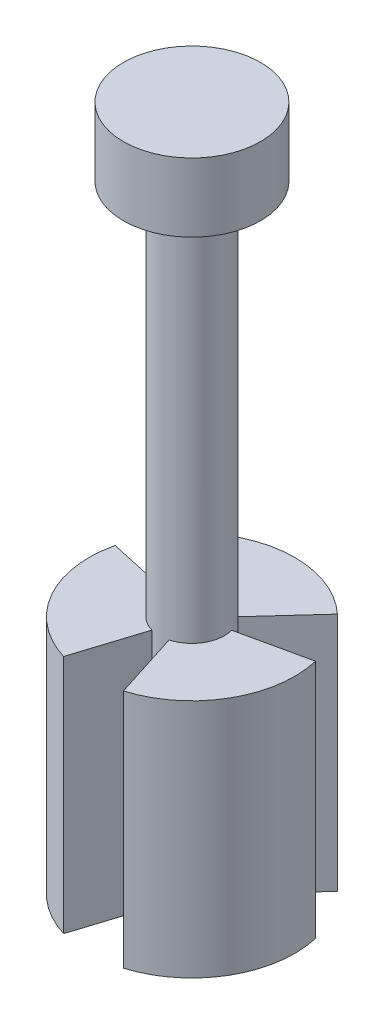
ISO-10303-21;
HEADER;
FILE_DESCRIPTION(('STEP AP214'),'2;1');
FILE_NAME('part.step','',(''),(''),'','','');
FILE_SCHEMA(('AUTOMOTIVE_DESIGN { 1 0 10303 214 1 1 1 1 }'));
ENDSEC;
DATA;
#1=APPLICATION_CONTEXT('core data for automotive mechanical design processes');
#2=APPLICATION_PROTOCOL_DEFINITION('international standard','automotive_design',2000,#1);
#3=PRODUCT_CONTEXT('',#1,'mechanical');
#4=PRODUCT('Part','Part','',(#3));
#5=PRODUCT_RELATED_PRODUCT_CATEGORY('part','',(#4));
#6=PRODUCT_DEFINITION_FORMATION('','',#4);
#7=PRODUCT_DEFINITION_CONTEXT('part definition',#1,'design');
#8=PRODUCT_DEFINITION('design','',#6,#7);
#9=PRODUCT_DEFINITION_SHAPE('','',#8);
#10=(LENGTH_UNIT() NAMED_UNIT(*) SI_UNIT(.MILLI.,.METRE.));
#11=(NAMED_UNIT(*) PLANE_ANGLE_UNIT() SI_UNIT($,.RADIAN.));
#12=(NAMED_UNIT(*) SI_UNIT($,.STERADIAN.) SOLID_ANGLE_UNIT());
#13=UNCERTAINTY_MEASURE_WITH_UNIT(LENGTH_MEASURE(1.E-05),#10,'distance_accuracy_value','');
#14=(GEOMETRIC_REPRESENTATION_CONTEXT(3) GLOBAL_UNCERTAINTY_ASSIGNED_CONTEXT((#13)) GLOBAL_UNIT_ASSIGNED_CONTEXT((#10,
#11,#12)) REPRESENTATION_CONTEXT('',''));
#15=CARTESIAN_POINT('',(0.,0.,0.));
#16=DIRECTION('',(0.,0.,1.));
#17=DIRECTION('',(1.,0.,0.));
#18=AXIS2_PLACEMENT_3D('',#15,#16,#17);
#19=CARTESIAN_POINT('',(0.,20.,0.));
#20=DIRECTION('',(0.,-1.,0.));
#21=DIRECTION('',(0.,0.,-1.));
#22=AXIS2_PLACEMENT_3D('',#19,#20,#21);
#23=CYLINDRICAL_SURFACE('',#22,0.95);
#24=CARTESIAN_POINT('',(0.,7.,0.));
#25=DIRECTION('',(0.,-1.,0.));
#26=DIRECTION('',(0.,0.,-1.));
#27=AXIS2_PLACEMENT_3D('',#24,#25,#26);
#28=CIRCLE('',#27,0.95);
#29=CARTESIAN_POINT('',(-0.25,7.,0.916515138991167));
#30=VERTEX_POINT('',#29);
#31=CARTESIAN_POINT('',(-0.918725393319376,7.,-0.241751218549478));
#32=VERTEX_POINT('',#31);
#33=EDGE_CURVE('E218',#30,#32,#28,.T.);
#34=ORIENTED_EDGE('',*,*,#33,.F.);
#35=DIRECTION('',(0.,1.,0.));
#36=VECTOR('',#35,1.);
#37=CARTESIAN_POINT('',(-0.25,0.,0.916515138991167));
#38=LINE('',#37,#36);
#39=CARTESIAN_POINT('',(-0.25,0.,0.916515138991167));
#40=VERTEX_POINT('',#39);
#41=EDGE_CURVE('E195',#40,#30,#38,.T.);
#42=ORIENTED_EDGE('',*,*,#41,.F.);
#43=CARTESIAN_POINT('',(0.,0.,0.));
#44=DIRECTION('',(0.,-1.,0.));
#45=DIRECTION('',(0.,0.,1.));
#46=AXIS2_PLACEMENT_3D('',#43,#44,#45);
#47=CIRCLE('',#46,0.95);
#48=CARTESIAN_POINT('',(0.25,0.,0.916515138991167));
#49=VERTEX_POINT('',#48);
#50=EDGE_CURVE('E188',#49,#40,#47,.T.);
#51=ORIENTED_EDGE('',*,*,#50,.F.);
#52=DIRECTION('',(0.,1.,0.));
#53=VECTOR('',#52,1.);
#54=CARTESIAN_POINT('',(0.25,0.,0.916515138991167));
#55=LINE('',#54,#53);
#56=CARTESIAN_POINT('',(0.25,7.,0.916515138991167));
#57=VERTEX_POINT('',#56);
#58=EDGE_CURVE('E199',#49,#57,#55,.T.);
#59=ORIENTED_EDGE('',*,*,#58,.T.);
#60=CARTESIAN_POINT('',(0.918725393319379,7.,-0.241751218549466));
#61=VERTEX_POINT('',#60);
#62=EDGE_CURVE('E212',#61,#57,#28,.T.);
#63=ORIENTED_EDGE('',*,*,#62,.F.);
#64=DIRECTION('',(0.,1.,0.));
#65=VECTOR('',#64,1.);
#66=CARTESIAN_POINT('',(0.918725393319379,0.,-0.241751218549466));
#67=LINE('',#66,#65);
#68=CARTESIAN_POINT('',(0.918725393319379,0.,-0.241751218549466));
#69=VERTEX_POINT('',#68);
#70=EDGE_CURVE('E175',#69,#61,#67,.T.);
#71=ORIENTED_EDGE('',*,*,#70,.F.);
#72=CARTESIAN_POINT('',(0.,0.,0.));
#73=DIRECTION('',(0.,-1.,0.));
#74=DIRECTION('',(0.866025403784443,0.,-0.499999999999992));
#75=AXIS2_PLACEMENT_3D('',#72,#73,#74);
#76=CIRCLE('',#75,0.95);
#77=CARTESIAN_POINT('',(0.668725393319383,0.,-0.674763920441687));
#78=VERTEX_POINT('',#77);
#79=EDGE_CURVE('E169',#78,#69,#76,.T.);
#80=ORIENTED_EDGE('',*,*,#79,.F.);
#81=DIRECTION('',(0.,1.,0.));
#82=VECTOR('',#81,1.);
#83=CARTESIAN_POINT('',(0.668725393319383,0.,-0.674763920441687));
#84=LINE('',#83,#82);
#85=CARTESIAN_POINT('',(0.668725393319383,7.,-0.674763920441687));
#86=VERTEX_POINT('',#85);
#87=EDGE_CURVE('E166',#78,#86,#84,.T.);
#88=ORIENTED_EDGE('',*,*,#87,.T.);
#89=CARTESIAN_POINT('',(-0.668725393319374,7.,-0.674763920441697));
#90=VERTEX_POINT('',#89);
#91=EDGE_CURVE('E146',#90,#86,#28,.T.);
#92=ORIENTED_EDGE('',*,*,#91,.F.);
#93=DIRECTION('',(0.,1.,0.));
#94=VECTOR('',#93,1.);
#95=CARTESIAN_POINT('',(-0.668725393319374,0.,-0.674763920441697));
#96=LINE('',#95,#94);
#97=CARTESIAN_POINT('',(-0.668725393319374,0.,-0.674763920441697));
#98=VERTEX_POINT('',#97);
#99=EDGE_CURVE('E137',#98,#90,#96,.T.);
#100=ORIENTED_EDGE('',*,*,#99,.F.);
#101=CARTESIAN_POINT('',(0.,0.,0.));
#102=DIRECTION('',(0.,-1.,0.));
#103=DIRECTION('',(-0.866025403784436,0.,-0.500000000000004));
#104=AXIS2_PLACEMENT_3D('',#101,#102,#103);
#105=CIRCLE('',#104,0.95);
#106=CARTESIAN_POINT('',(-0.918725393319376,0.,-0.241751218549478));
#107=VERTEX_POINT('',#106);
#108=EDGE_CURVE('E142',#107,#98,#105,.T.);
#109=ORIENTED_EDGE('',*,*,#108,.F.);
#110=DIRECTION('',(0.,1.,0.));
#111=VECTOR('',#110,1.);
#112=CARTESIAN_POINT('',(-0.918725393319376,0.,-0.241751218549478));
#113=LINE('',#112,#111);
#114=EDGE_CURVE('E148',#107,#32,#113,.T.);
#115=ORIENTED_EDGE('',*,*,#114,.T.);
#116=EDGE_LOOP('',(#34,#42,#51,#59,#63,#71,#80,#88,#92,#100,#109,#115));
#117=FACE_BOUND('',#116,.T.);
#118=CARTESIAN_POINT('',(0.,18.,0.));
#119=DIRECTION('',(0.,1.,0.));
#120=DIRECTION('',(0.,0.,1.));
#121=AXIS2_PLACEMENT_3D('',#118,#119,#120);
#122=CIRCLE('',#121,0.95);
#123=CARTESIAN_POINT('',(0.,18.,0.95));
#124=VERTEX_POINT('',#123);
#125=EDGE_CURVE('E11',#124,#124,#122,.T.);
#126=ORIENTED_EDGE('',*,*,#125,.F.);
#127=EDGE_LOOP('',(#126));
#128=FACE_BOUND('',#127,.T.);
#129=ADVANCED_FACE('F47',(#117,#128),#23,.T.);
#130=CARTESIAN_POINT('',(0.,7.,0.));
#131=DIRECTION('',(0.,-1.,0.));
#132=DIRECTION('',(0.,0.,-1.));
#133=AXIS2_PLACEMENT_3D('',#130,#131,#132);
#134=CYLINDRICAL_SURFACE('',#133,3.);
#135=DIRECTION('',(0.,-1.,0.));
#136=VECTOR('',#135,1.);
#137=CARTESIAN_POINT('',(-2.92166734411922,7.,-0.681072632182037));
#138=LINE('',#137,#136);
#139=CARTESIAN_POINT('',(-2.92166734411922,0.,-0.681072632182037));
#140=VERTEX_POINT('',#139);
#141=CARTESIAN_POINT('',(-2.92166734411922,7.,-0.681072632182037));
#142=VERTEX_POINT('',#141);
#143=EDGE_CURVE('E185',#140,#142,#138,.F.);
#144=ORIENTED_EDGE('',*,*,#143,.F.);
#145=CARTESIAN_POINT('',(0.,0.,0.));
#146=DIRECTION('',(0.,-1.,0.));
#147=DIRECTION('',(0.,0.,-1.));
#148=AXIS2_PLACEMENT_3D('',#145,#146,#147);
#149=CIRCLE('',#148,3.);
#150=CARTESIAN_POINT('',(-0.871007470767643,0.,2.87077445750567));
#151=VERTEX_POINT('',#150);
#152=EDGE_CURVE('E215',#151,#140,#149,.T.);
#153=ORIENTED_EDGE('',*,*,#152,.F.);
#154=DIRECTION('',(0.,-1.,0.));
#155=VECTOR('',#154,1.);
#156=CARTESIAN_POINT('',(-0.871007470767643,7.,2.87077445750567));
#157=LINE('',#156,#155);
#158=CARTESIAN_POINT('',(-0.871007470767642,7.,2.87077445750567));
#159=VERTEX_POINT('',#158);
#160=EDGE_CURVE('E202',#159,#151,#157,.T.);
#161=ORIENTED_EDGE('',*,*,#160,.F.);
#162=CARTESIAN_POINT('',(0.,7.,0.));
#163=DIRECTION('',(0.,-1.,0.));
#164=DIRECTION('',(0.,0.,-1.));
#165=AXIS2_PLACEMENT_3D('',#162,#163,#164);
#166=CIRCLE('',#165,3.);
#167=EDGE_CURVE('E209',#159,#142,#166,.T.);
#168=ORIENTED_EDGE('',*,*,#167,.T.);
#169=EDGE_LOOP('',(#144,#153,#161,#168));
#170=FACE_BOUND('',#169,.T.);
#171=ADVANCED_FACE('F261',(#170),#134,.T.);
#172=DIRECTION('',(0.,-1.,0.));
#173=VECTOR('',#172,1.);
#174=CARTESIAN_POINT('',(-2.05065987335157,7.,-2.18970182532365));
#175=LINE('',#174,#173);
#176=CARTESIAN_POINT('',(-2.05065987335157,7.,-2.18970182532365));
#177=VERTEX_POINT('',#176);
#178=CARTESIAN_POINT('',(-2.05065987335157,0.,-2.18970182532365));
#179=VERTEX_POINT('',#178);
#180=EDGE_CURVE('E69',#177,#179,#175,.T.);
#181=ORIENTED_EDGE('',*,*,#180,.F.);
#182=CARTESIAN_POINT('',(2.0506598733516,7.,-2.18970182532362));
#183=VERTEX_POINT('',#182);
#184=EDGE_CURVE('E213',#177,#183,#166,.T.);
#185=ORIENTED_EDGE('',*,*,#184,.T.);
#186=DIRECTION('',(0.,-1.,0.));
#187=VECTOR('',#186,1.);
#188=CARTESIAN_POINT('',(2.0506598733516,7.,-2.18970182532363));
#189=LINE('',#188,#187);
#190=CARTESIAN_POINT('',(2.0506598733516,0.,-2.18970182532362));
#191=VERTEX_POINT('',#190);
#192=EDGE_CURVE('E182',#191,#183,#189,.F.);
#193=ORIENTED_EDGE('',*,*,#192,.F.);
#194=EDGE_CURVE('E217',#179,#191,#149,.T.);
#195=ORIENTED_EDGE('',*,*,#194,.F.);
#196=EDGE_LOOP('',(#181,#185,#193,#195));
#197=FACE_BOUND('',#196,.T.);
#198=ADVANCED_FACE('F233',(#197),#134,.T.);
#199=CARTESIAN_POINT('',(0.,7.,0.));
#200=DIRECTION('',(0.,-1.,0.));
#201=DIRECTION('',(0.,0.,-1.));
#202=AXIS2_PLACEMENT_3D('',#199,#200,#201);
#203=PLANE('',#202);
#204=ORIENTED_EDGE('',*,*,#33,.T.);
#205=DIRECTION('',(0.976779949274853,0.,0.2142450249005));
#206=VECTOR('',#205,1.);
#207=CARTESIAN_POINT('',(-0.918725393319376,7.,-0.241751218549478));
#208=LINE('',#207,#206);
#209=EDGE_CURVE('E158',#142,#32,#208,.T.);
#210=ORIENTED_EDGE('',*,*,#209,.F.);
#211=ORIENTED_EDGE('',*,*,#167,.F.);
#212=DIRECTION('',(-0.302848340439169,0.,0.953038762429546));
#213=VECTOR('',#212,1.);
#214=CARTESIAN_POINT('',(-1.15854502131751,7.,3.77563142627981));
#215=LINE('',#214,#213);
#216=EDGE_CURVE('E187',#30,#159,#215,.T.);
#217=ORIENTED_EDGE('',*,*,#216,.F.);
#218=EDGE_LOOP('',(#204,#210,#211,#217));
#219=FACE_BOUND('',#218,.T.);
#220=ADVANCED_FACE('F264',(#219),#203,.F.);
#221=ORIENTED_EDGE('',*,*,#184,.F.);
#222=DIRECTION('',(-0.673931608835682,0.,-0.738793737529055));
#223=VECTOR('',#222,1.);
#224=CARTESIAN_POINT('',(-2.69052021982642,7.,-2.89114513302886));
#225=LINE('',#224,#223);
#226=EDGE_CURVE('E160',#90,#177,#225,.T.);
#227=ORIENTED_EDGE('',*,*,#226,.F.);
#228=ORIENTED_EDGE('',*,*,#91,.T.);
#229=DIRECTION('',(-0.673931608835692,0.,0.738793737529045));
#230=VECTOR('',#229,1.);
#231=CARTESIAN_POINT('',(0.668725393319383,7.,-0.674763920441687));
#232=LINE('',#231,#230);
#233=EDGE_CURVE('E173',#183,#86,#232,.T.);
#234=ORIENTED_EDGE('',*,*,#233,.F.);
#235=EDGE_LOOP('',(#221,#227,#228,#234));
#236=FACE_BOUND('',#235,.T.);
#237=ADVANCED_FACE('F249',(#236),#203,.F.);
#238=DIRECTION('',(0.,-1.,0.));
#239=VECTOR('',#238,1.);
#240=CARTESIAN_POINT('',(2.92166734411923,7.,-0.681072632181997));
#241=LINE('',#240,#239);
#242=CARTESIAN_POINT('',(2.92166734411923,7.,-0.681072632181997));
#243=VERTEX_POINT('',#242);
#244=CARTESIAN_POINT('',(2.92166734411923,0.,-0.681072632181997));
#245=VERTEX_POINT('',#244);
#246=EDGE_CURVE('E61',#243,#245,#241,.T.);
#247=ORIENTED_EDGE('',*,*,#246,.F.);
#248=CARTESIAN_POINT('',(0.871007470767643,7.,2.87077445750567));
#249=VERTEX_POINT('',#248);
#250=EDGE_CURVE('E214',#243,#249,#166,.T.);
#251=ORIENTED_EDGE('',*,*,#250,.T.);
#252=DIRECTION('',(0.,-1.,0.));
#253=VECTOR('',#252,1.);
#254=CARTESIAN_POINT('',(0.871007470767643,7.,2.87077445750567));
#255=LINE('',#254,#253);
#256=CARTESIAN_POINT('',(0.871007470767643,0.,2.87077445750567));
#257=VERTEX_POINT('',#256);
#258=EDGE_CURVE('E205',#257,#249,#255,.F.);
#259=ORIENTED_EDGE('',*,*,#258,.F.);
#260=EDGE_CURVE('E208',#245,#257,#149,.T.);
#261=ORIENTED_EDGE('',*,*,#260,.F.);
#262=EDGE_LOOP('',(#247,#251,#259,#261));
#263=FACE_BOUND('',#262,.T.);
#264=ADVANCED_FACE('F239',(#263),#134,.T.);
#265=ORIENTED_EDGE('',*,*,#250,.F.);
#266=DIRECTION('',(0.976779949274856,0.,-0.214245024900486));
#267=VECTOR('',#266,1.);
#268=CARTESIAN_POINT('',(3.84906524114395,7.,-0.884486293250924));
#269=LINE('',#268,#267);
#270=EDGE_CURVE('E176',#61,#243,#269,.T.);
#271=ORIENTED_EDGE('',*,*,#270,.F.);
#272=ORIENTED_EDGE('',*,*,#62,.T.);
#273=DIRECTION('',(-0.302848340439169,0.,-0.953038762429546));
#274=VECTOR('',#273,1.);
#275=CARTESIAN_POINT('',(0.25,7.,0.916515138991167));
#276=LINE('',#275,#274);
#277=EDGE_CURVE('E192',#249,#57,#276,.T.);
#278=ORIENTED_EDGE('',*,*,#277,.F.);
#279=EDGE_LOOP('',(#265,#271,#272,#278));
#280=FACE_BOUND('',#279,.T.);
#281=ADVANCED_FACE('F247',(#280),#203,.F.);
#282=CARTESIAN_POINT('',(0.,0.,0.));
#283=DIRECTION('',(0.,1.,0.));
#284=DIRECTION('',(0.,0.,1.));
#285=AXIS2_PLACEMENT_3D('',#282,#283,#284);
#286=PLANE('',#285);
#287=ORIENTED_EDGE('',*,*,#152,.T.);
#288=DIRECTION('',(0.976779949274853,0.,0.214245024900499));
#289=VECTOR('',#288,1.);
#290=CARTESIAN_POINT('',(0.00842098602110976,0.,-0.0383927248829415));
#291=LINE('',#290,#289);
#292=EDGE_CURVE('E54',#140,#107,#291,.T.);
#293=ORIENTED_EDGE('',*,*,#292,.T.);
#294=ORIENTED_EDGE('',*,*,#108,.T.);
#295=DIRECTION('',(-0.673931608835682,0.,-0.738793737529055));
#296=VECTOR('',#295,1.);
#297=CARTESIAN_POINT('',(-2.69052021982642,0.,-2.89114513302886));
#298=LINE('',#297,#296);
#299=EDGE_CURVE('E149',#98,#179,#298,.T.);
#300=ORIENTED_EDGE('',*,*,#299,.T.);
#301=ORIENTED_EDGE('',*,*,#194,.T.);
#302=DIRECTION('',(-0.673931608835692,0.,0.738793737529045));
#303=VECTOR('',#302,1.);
#304=CARTESIAN_POINT('',(0.0290385820585794,0.,0.0264891502606657));
#305=LINE('',#304,#303);
#306=EDGE_CURVE('E224',#191,#78,#305,.T.);
#307=ORIENTED_EDGE('',*,*,#306,.T.);
#308=ORIENTED_EDGE('',*,*,#79,.T.);
#309=DIRECTION('',(0.976779949274856,0.,-0.214245024900486));
#310=VECTOR('',#309,1.);
#311=CARTESIAN_POINT('',(3.84906524114395,0.,-0.884486293250924));
#312=LINE('',#311,#310);
#313=EDGE_CURVE('E172',#69,#245,#312,.T.);
#314=ORIENTED_EDGE('',*,*,#313,.T.);
#315=ORIENTED_EDGE('',*,*,#260,.T.);
#316=DIRECTION('',(-0.302848340439169,0.,-0.953038762429546));
#317=VECTOR('',#316,1.);
#318=CARTESIAN_POINT('',(-0.0374595680796892,0.,0.0119035746222763));
#319=LINE('',#318,#317);
#320=EDGE_CURVE('E221',#257,#49,#319,.T.);
#321=ORIENTED_EDGE('',*,*,#320,.T.);
#322=ORIENTED_EDGE('',*,*,#50,.T.);
#323=DIRECTION('',(-0.302848340439169,0.,0.953038762429546));
#324=VECTOR('',#323,1.);
#325=CARTESIAN_POINT('',(-1.15854502131751,0.,3.77563142627981));
#326=LINE('',#325,#324);
#327=EDGE_CURVE('E191',#40,#151,#326,.T.);
#328=ORIENTED_EDGE('',*,*,#327,.T.);
#329=EDGE_LOOP('',(#287,#293,#294,#300,#301,#307,#308,#314,#315,#321,#322,#328));
#330=FACE_BOUND('',#329,.T.);
#331=ADVANCED_FACE('F157',(#330),#286,.F.);
#332=CARTESIAN_POINT('',(0.25,0.,0.916515138991167));
#333=DIRECTION('',(0.953038762429546,0.,-0.302848340439169));
#334=DIRECTION('',(-0.302848340439169,0.,-0.953038762429546));
#335=AXIS2_PLACEMENT_3D('',#332,#333,#334);
#336=PLANE('',#335);
#337=ORIENTED_EDGE('',*,*,#258,.T.);
#338=ORIENTED_EDGE('',*,*,#277,.T.);
#339=ORIENTED_EDGE('',*,*,#58,.F.);
#340=ORIENTED_EDGE('',*,*,#320,.F.);
#341=EDGE_LOOP('',(#337,#338,#339,#340));
#342=FACE_BOUND('',#341,.T.);
#343=ADVANCED_FACE('F246',(#342),#336,.F.);
#344=CARTESIAN_POINT('',(-1.15854502131751,0.,3.77563142627981));
#345=DIRECTION('',(-0.953038762429547,0.,-0.302848340439169));
#346=DIRECTION('',(-0.302848340439169,0.,0.953038762429547));
#347=AXIS2_PLACEMENT_3D('',#344,#345,#346);
#348=PLANE('',#347);
#349=ORIENTED_EDGE('',*,*,#160,.T.);
#350=ORIENTED_EDGE('',*,*,#327,.F.);
#351=ORIENTED_EDGE('',*,*,#41,.T.);
#352=ORIENTED_EDGE('',*,*,#216,.T.);
#353=EDGE_LOOP('',(#349,#350,#351,#352));
#354=FACE_BOUND('',#353,.T.);
#355=ADVANCED_FACE('F256',(#354),#348,.F.);
#356=CARTESIAN_POINT('',(0.668725393319383,0.,-0.674763920441687));
#357=DIRECTION('',(-0.738793737529045,0.,-0.673931608835692));
#358=DIRECTION('',(-0.673931608835692,0.,0.738793737529045));
#359=AXIS2_PLACEMENT_3D('',#356,#357,#358);
#360=PLANE('',#359);
#361=ORIENTED_EDGE('',*,*,#192,.T.);
#362=ORIENTED_EDGE('',*,*,#233,.T.);
#363=ORIENTED_EDGE('',*,*,#87,.F.);
#364=ORIENTED_EDGE('',*,*,#306,.F.);
#365=EDGE_LOOP('',(#361,#362,#363,#364));
#366=FACE_BOUND('',#365,.T.);
#367=ADVANCED_FACE('F229',(#366),#360,.F.);
#368=CARTESIAN_POINT('',(3.84906524114395,0.,-0.884486293250924));
#369=DIRECTION('',(0.214245024900486,0.,0.976779949274856));
#370=DIRECTION('',(0.976779949274856,0.,-0.214245024900486));
#371=AXIS2_PLACEMENT_3D('',#368,#369,#370);
#372=PLANE('',#371);
#373=ORIENTED_EDGE('',*,*,#246,.T.);
#374=ORIENTED_EDGE('',*,*,#313,.F.);
#375=ORIENTED_EDGE('',*,*,#70,.T.);
#376=ORIENTED_EDGE('',*,*,#270,.T.);
#377=EDGE_LOOP('',(#373,#374,#375,#376));
#378=FACE_BOUND('',#377,.T.);
#379=ADVANCED_FACE('F250',(#378),#372,.F.);
#380=CARTESIAN_POINT('',(-0.918725393319376,0.,-0.241751218549478));
#381=DIRECTION('',(-0.2142450249005,0.,0.976779949274853));
#382=DIRECTION('',(0.976779949274853,0.,0.214245024900499));
#383=AXIS2_PLACEMENT_3D('',#380,#381,#382);
#384=PLANE('',#383);
#385=ORIENTED_EDGE('',*,*,#143,.T.);
#386=ORIENTED_EDGE('',*,*,#209,.T.);
#387=ORIENTED_EDGE('',*,*,#114,.F.);
#388=ORIENTED_EDGE('',*,*,#292,.F.);
#389=EDGE_LOOP('',(#385,#386,#387,#388));
#390=FACE_BOUND('',#389,.T.);
#391=ADVANCED_FACE('F266',(#390),#384,.F.);
#392=CARTESIAN_POINT('',(-2.69052021982642,0.,-2.89114513302886));
#393=DIRECTION('',(0.738793737529054,0.,-0.673931608835682));
#394=DIRECTION('',(-0.673931608835682,0.,-0.738793737529054));
#395=AXIS2_PLACEMENT_3D('',#392,#393,#394);
#396=PLANE('',#395);
#397=ORIENTED_EDGE('',*,*,#180,.T.);
#398=ORIENTED_EDGE('',*,*,#299,.F.);
#399=ORIENTED_EDGE('',*,*,#99,.T.);
#400=ORIENTED_EDGE('',*,*,#226,.T.);
#401=EDGE_LOOP('',(#397,#398,#399,#400));
#402=FACE_BOUND('',#401,.T.);
#403=ADVANCED_FACE('F151',(#402),#396,.F.);
#404=CARTESIAN_POINT('',(0.,25.6568542494924,0.));
#405=DIRECTION('',(0.,-1.,0.));
#406=DIRECTION('',(0.,0.,-1.));
#407=AXIS2_PLACEMENT_3D('',#404,#405,#406);
#408=CYLINDRICAL_SURFACE('',#407,2.);
#409=CARTESIAN_POINT('',(0.,18.,0.));
#410=DIRECTION('',(0.,1.,0.));
#411=DIRECTION('',(0.,0.,1.));
#412=AXIS2_PLACEMENT_3D('',#409,#410,#411);
#413=CIRCLE('',#412,2.);
#414=CARTESIAN_POINT('',(0.,18.,2.));
#415=VERTEX_POINT('',#414);
#416=EDGE_CURVE('E439',#415,#415,#413,.T.);
#417=ORIENTED_EDGE('',*,*,#416,.T.);
#418=EDGE_LOOP('',(#417));
#419=FACE_BOUND('',#418,.T.);
#420=CARTESIAN_POINT('',(0.,20.,0.));
#421=DIRECTION('',(0.,1.,0.));
#422=DIRECTION('',(0.,0.,1.));
#423=AXIS2_PLACEMENT_3D('',#420,#421,#422);
#424=CIRCLE('',#423,2.);
#425=CARTESIAN_POINT('',(0.,20.,2.));
#426=VERTEX_POINT('',#425);
#427=EDGE_CURVE('E163',#426,#426,#424,.T.);
#428=ORIENTED_EDGE('',*,*,#427,.F.);
#429=EDGE_LOOP('',(#428));
#430=FACE_BOUND('',#429,.T.);
#431=ADVANCED_FACE('F273',(#419,#430),#408,.T.);
#432=CARTESIAN_POINT('',(0.,18.,0.));
#433=DIRECTION('',(0.,1.,0.));
#434=DIRECTION('',(0.,0.,1.));
#435=AXIS2_PLACEMENT_3D('',#432,#433,#434);
#436=PLANE('',#435);
#437=ORIENTED_EDGE('',*,*,#125,.T.);
#438=EDGE_LOOP('',(#437));
#439=FACE_BOUND('',#438,.T.);
#440=ORIENTED_EDGE('',*,*,#416,.F.);
#441=EDGE_LOOP('',(#440));
#442=FACE_BOUND('',#441,.T.);
#443=ADVANCED_FACE('F346',(#439,#442),#436,.F.);
#444=CARTESIAN_POINT('',(0.,20.,0.));
#445=DIRECTION('',(0.,1.,0.));
#446=DIRECTION('',(0.,0.,1.));
#447=AXIS2_PLACEMENT_3D('',#444,#445,#446);
#448=PLANE('',#447);
#449=ORIENTED_EDGE('',*,*,#427,.T.);
#450=EDGE_LOOP('',(#449));
#451=FACE_BOUND('',#450,.T.);
#452=ADVANCED_FACE('F355',(#451),#448,.T.);
#453=CLOSED_SHELL('',(#129,#171,#198,#220,#237,#264,#281,#331,#343,#355,#367,#379,#391,#403,
#431,#443,#452));
#454=MANIFOLD_SOLID_BREP('B2',#453);
#455=ADVANCED_BREP_SHAPE_REPRESENTATION('',(#18,#454),#14);
#456=SHAPE_DEFINITION_REPRESENTATION(#9,#455);
ENDSEC;
END-ISO-10303-21;
